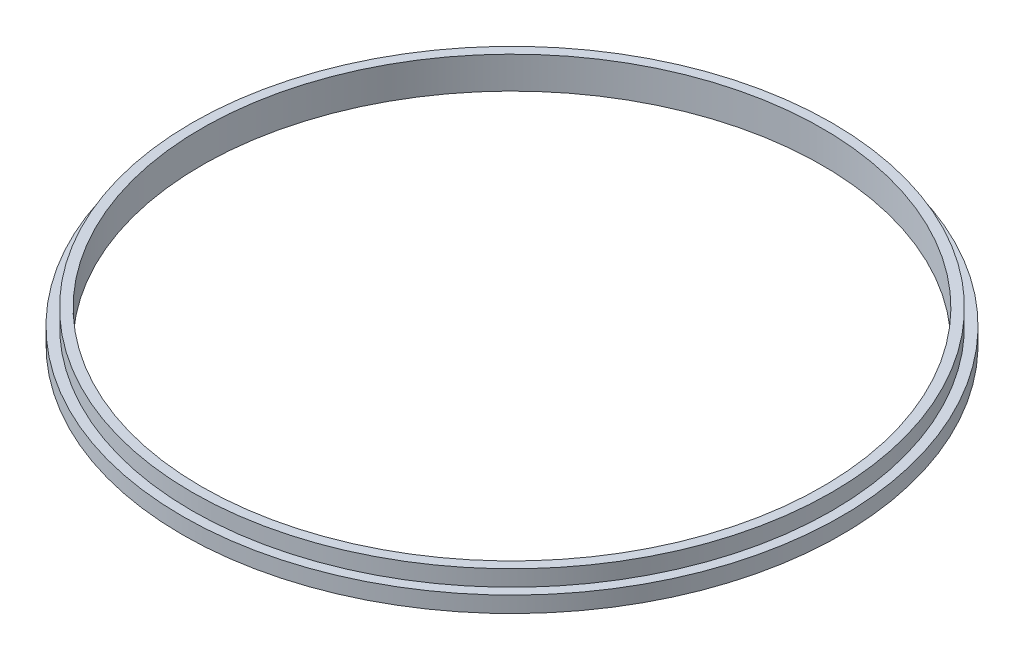
ISO-10303-21;
HEADER;
FILE_DESCRIPTION(('STEP AP214'),'2;1');
FILE_NAME('part.step','',(''),(''),'','','');
FILE_SCHEMA(('AUTOMOTIVE_DESIGN { 1 0 10303 214 1 1 1 1 }'));
ENDSEC;
DATA;
#1=APPLICATION_CONTEXT('core data for automotive mechanical design processes');
#2=APPLICATION_PROTOCOL_DEFINITION('international standard','automotive_design',2000,#1);
#3=PRODUCT_CONTEXT('',#1,'mechanical');
#4=PRODUCT('Part','Part','',(#3));
#5=PRODUCT_RELATED_PRODUCT_CATEGORY('part','',(#4));
#6=PRODUCT_DEFINITION_FORMATION('','',#4);
#7=PRODUCT_DEFINITION_CONTEXT('part definition',#1,'design');
#8=PRODUCT_DEFINITION('design','',#6,#7);
#9=PRODUCT_DEFINITION_SHAPE('','',#8);
#10=(LENGTH_UNIT() NAMED_UNIT(*) SI_UNIT(.MILLI.,.METRE.));
#11=(NAMED_UNIT(*) PLANE_ANGLE_UNIT() SI_UNIT($,.RADIAN.));
#12=(NAMED_UNIT(*) SI_UNIT($,.STERADIAN.) SOLID_ANGLE_UNIT());
#13=UNCERTAINTY_MEASURE_WITH_UNIT(LENGTH_MEASURE(1.E-05),#10,'distance_accuracy_value','');
#14=(GEOMETRIC_REPRESENTATION_CONTEXT(3) GLOBAL_UNCERTAINTY_ASSIGNED_CONTEXT((#13)) GLOBAL_UNIT_ASSIGNED_CONTEXT((#10,
#11,#12)) REPRESENTATION_CONTEXT('',''));
#15=CARTESIAN_POINT('',(0.,0.,0.));
#16=DIRECTION('',(0.,0.,1.));
#17=DIRECTION('',(1.,0.,0.));
#18=AXIS2_PLACEMENT_3D('',#15,#16,#17);
#19=CARTESIAN_POINT('',(0.,5.,0.));
#20=DIRECTION('',(0.,1.,0.));
#21=DIRECTION('',(0.,0.,1.));
#22=AXIS2_PLACEMENT_3D('',#19,#20,#21);
#23=PLANE('',#22);
#24=CARTESIAN_POINT('',(0.,5.,0.));
#25=DIRECTION('',(0.,1.,0.));
#26=DIRECTION('',(0.,0.,1.));
#27=AXIS2_PLACEMENT_3D('',#24,#25,#26);
#28=CIRCLE('',#27,103.);
#29=CARTESIAN_POINT('',(0.,5.,103.));
#30=VERTEX_POINT('',#29);
#31=EDGE_CURVE('E10',#30,#30,#28,.T.);
#32=ORIENTED_EDGE('',*,*,#31,.T.);
#33=EDGE_LOOP('',(#32));
#34=FACE_BOUND('',#33,.T.);
#35=CARTESIAN_POINT('',(0.,5.,0.));
#36=DIRECTION('',(0.,1.,0.));
#37=DIRECTION('',(0.,0.,1.));
#38=AXIS2_PLACEMENT_3D('',#35,#36,#37);
#39=CIRCLE('',#38,100.);
#40=CARTESIAN_POINT('',(0.,5.,100.));
#41=VERTEX_POINT('',#40);
#42=EDGE_CURVE('E62',#41,#41,#39,.T.);
#43=ORIENTED_EDGE('',*,*,#42,.F.);
#44=EDGE_LOOP('',(#43));
#45=FACE_BOUND('',#44,.T.);
#46=ADVANCED_FACE('F43',(#34,#45),#23,.T.);
#47=CARTESIAN_POINT('',(0.,0.,0.));
#48=DIRECTION('',(0.,1.,0.));
#49=DIRECTION('',(0.,0.,1.));
#50=AXIS2_PLACEMENT_3D('',#47,#48,#49);
#51=PLANE('',#50);
#52=CARTESIAN_POINT('',(0.,0.,0.));
#53=DIRECTION('',(0.,1.,0.));
#54=DIRECTION('',(0.,0.,1.));
#55=AXIS2_PLACEMENT_3D('',#52,#53,#54);
#56=CIRCLE('',#55,103.);
#57=CARTESIAN_POINT('',(0.,0.,103.));
#58=VERTEX_POINT('',#57);
#59=EDGE_CURVE('E47',#58,#58,#56,.T.);
#60=ORIENTED_EDGE('',*,*,#59,.F.);
#61=EDGE_LOOP('',(#60));
#62=FACE_BOUND('',#61,.T.);
#63=CARTESIAN_POINT('',(0.,0.,0.));
#64=DIRECTION('',(0.,1.,0.));
#65=DIRECTION('',(0.,0.,1.));
#66=AXIS2_PLACEMENT_3D('',#63,#64,#65);
#67=CIRCLE('',#66,97.);
#68=CARTESIAN_POINT('',(0.,0.,97.));
#69=VERTEX_POINT('',#68);
#70=EDGE_CURVE('E56',#69,#69,#67,.T.);
#71=ORIENTED_EDGE('',*,*,#70,.T.);
#72=EDGE_LOOP('',(#71));
#73=FACE_BOUND('',#72,.T.);
#74=ADVANCED_FACE('F90',(#62,#73),#51,.F.);
#75=CARTESIAN_POINT('',(0.,5.,0.));
#76=DIRECTION('',(0.,-1.,0.));
#77=DIRECTION('',(0.,0.,-1.));
#78=AXIS2_PLACEMENT_3D('',#75,#76,#77);
#79=CYLINDRICAL_SURFACE('',#78,103.);
#80=ORIENTED_EDGE('',*,*,#31,.F.);
#81=EDGE_LOOP('',(#80));
#82=FACE_BOUND('',#81,.T.);
#83=ORIENTED_EDGE('',*,*,#59,.T.);
#84=EDGE_LOOP('',(#83));
#85=FACE_BOUND('',#84,.T.);
#86=ADVANCED_FACE('F45',(#82,#85),#79,.T.);
#87=CARTESIAN_POINT('',(0.,5.,0.));
#88=DIRECTION('',(0.,-1.,0.));
#89=DIRECTION('',(0.,0.,-1.));
#90=AXIS2_PLACEMENT_3D('',#87,#88,#89);
#91=CYLINDRICAL_SURFACE('',#90,97.);
#92=ORIENTED_EDGE('',*,*,#70,.F.);
#93=EDGE_LOOP('',(#92));
#94=FACE_BOUND('',#93,.T.);
#95=CARTESIAN_POINT('',(0.,10.,0.));
#96=DIRECTION('',(0.,1.,0.));
#97=DIRECTION('',(0.,0.,1.));
#98=AXIS2_PLACEMENT_3D('',#95,#96,#97);
#99=CIRCLE('',#98,97.);
#100=CARTESIAN_POINT('',(0.,10.,97.));
#101=VERTEX_POINT('',#100);
#102=EDGE_CURVE('E66',#101,#101,#99,.T.);
#103=ORIENTED_EDGE('',*,*,#102,.T.);
#104=EDGE_LOOP('',(#103));
#105=FACE_BOUND('',#104,.T.);
#106=ADVANCED_FACE('F74',(#94,#105),#91,.F.);
#107=CARTESIAN_POINT('',(0.,10.,0.));
#108=DIRECTION('',(0.,1.,0.));
#109=DIRECTION('',(0.,0.,1.));
#110=AXIS2_PLACEMENT_3D('',#107,#108,#109);
#111=PLANE('',#110);
#112=CARTESIAN_POINT('',(0.,10.,0.));
#113=DIRECTION('',(0.,1.,0.));
#114=DIRECTION('',(0.,0.,1.));
#115=AXIS2_PLACEMENT_3D('',#112,#113,#114);
#116=CIRCLE('',#115,100.);
#117=CARTESIAN_POINT('',(0.,10.,100.));
#118=VERTEX_POINT('',#117);
#119=EDGE_CURVE('E61',#118,#118,#116,.T.);
#120=ORIENTED_EDGE('',*,*,#119,.T.);
#121=EDGE_LOOP('',(#120));
#122=FACE_BOUND('',#121,.T.);
#123=ORIENTED_EDGE('',*,*,#102,.F.);
#124=EDGE_LOOP('',(#123));
#125=FACE_BOUND('',#124,.T.);
#126=ADVANCED_FACE('F76',(#122,#125),#111,.T.);
#127=CARTESIAN_POINT('',(0.,10.,0.));
#128=DIRECTION('',(0.,-1.,0.));
#129=DIRECTION('',(0.,0.,-1.));
#130=AXIS2_PLACEMENT_3D('',#127,#128,#129);
#131=CYLINDRICAL_SURFACE('',#130,100.);
#132=ORIENTED_EDGE('',*,*,#119,.F.);
#133=EDGE_LOOP('',(#132));
#134=FACE_BOUND('',#133,.T.);
#135=ORIENTED_EDGE('',*,*,#42,.T.);
#136=EDGE_LOOP('',(#135));
#137=FACE_BOUND('',#136,.T.);
#138=ADVANCED_FACE('F78',(#134,#137),#131,.T.);
#139=CLOSED_SHELL('',(#46,#74,#86,#106,#126,#138));
#140=MANIFOLD_SOLID_BREP('B2',#139);
#141=ADVANCED_BREP_SHAPE_REPRESENTATION('',(#18,#140),#14);
#142=SHAPE_DEFINITION_REPRESENTATION(#9,#141);
ENDSEC;
END-ISO-10303-21;
